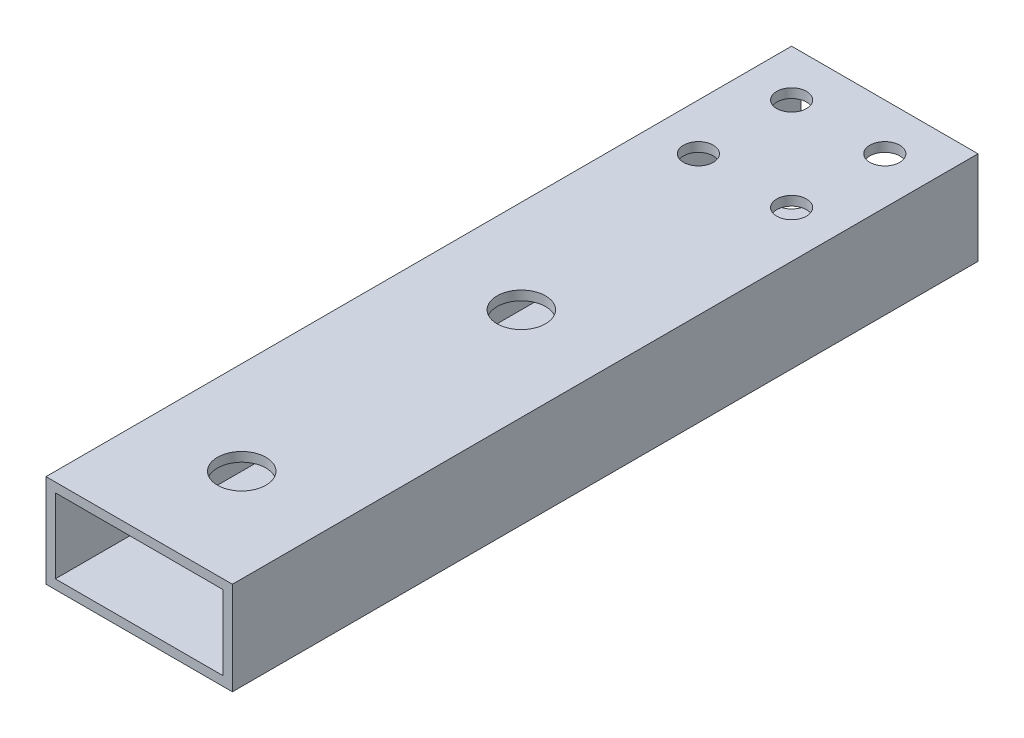
ISO-10303-21;
HEADER;
FILE_DESCRIPTION(('STEP AP214'),'2;1');
FILE_NAME('part.step','',(''),(''),'','','');
FILE_SCHEMA(('AUTOMOTIVE_DESIGN { 1 0 10303 214 1 1 1 1 }'));
ENDSEC;
DATA;
#1=APPLICATION_CONTEXT('core data for automotive mechanical design processes');
#2=APPLICATION_PROTOCOL_DEFINITION('international standard','automotive_design',2000,#1);
#3=PRODUCT_CONTEXT('',#1,'mechanical');
#4=PRODUCT('Part','Part','',(#3));
#5=PRODUCT_RELATED_PRODUCT_CATEGORY('part','',(#4));
#6=PRODUCT_DEFINITION_FORMATION('','',#4);
#7=PRODUCT_DEFINITION_CONTEXT('part definition',#1,'design');
#8=PRODUCT_DEFINITION('design','',#6,#7);
#9=PRODUCT_DEFINITION_SHAPE('','',#8);
#10=(LENGTH_UNIT() NAMED_UNIT(*) SI_UNIT(.MILLI.,.METRE.));
#11=(NAMED_UNIT(*) PLANE_ANGLE_UNIT() SI_UNIT($,.RADIAN.));
#12=(NAMED_UNIT(*) SI_UNIT($,.STERADIAN.) SOLID_ANGLE_UNIT());
#13=UNCERTAINTY_MEASURE_WITH_UNIT(LENGTH_MEASURE(1.E-05),#10,'distance_accuracy_value','');
#14=(GEOMETRIC_REPRESENTATION_CONTEXT(3) GLOBAL_UNCERTAINTY_ASSIGNED_CONTEXT((#13)) GLOBAL_UNIT_ASSIGNED_CONTEXT((#10,
#11,#12)) REPRESENTATION_CONTEXT('',''));
#15=CARTESIAN_POINT('',(0.,0.,0.));
#16=DIRECTION('',(0.,0.,1.));
#17=DIRECTION('',(1.,0.,0.));
#18=AXIS2_PLACEMENT_3D('',#15,#16,#17);
#19=CARTESIAN_POINT('',(0.,0.,80.));
#20=DIRECTION('',(0.,0.,1.));
#21=DIRECTION('',(1.,0.,0.));
#22=AXIS2_PLACEMENT_3D('',#19,#20,#21);
#23=PLANE('',#22);
#24=DIRECTION('',(0.,-1.,0.));
#25=VECTOR('',#24,1.);
#26=CARTESIAN_POINT('',(0.,0.,80.));
#27=LINE('',#26,#25);
#28=CARTESIAN_POINT('',(0.,0.,80.));
#29=VERTEX_POINT('',#28);
#30=CARTESIAN_POINT('',(0.,-10.,80.));
#31=VERTEX_POINT('',#30);
#32=EDGE_CURVE('E185',#29,#31,#27,.T.);
#33=ORIENTED_EDGE('',*,*,#32,.T.);
#34=DIRECTION('',(1.,0.,0.));
#35=VECTOR('',#34,1.);
#36=CARTESIAN_POINT('',(0.,-10.,80.));
#37=LINE('',#36,#35);
#38=CARTESIAN_POINT('',(20.,-10.,80.));
#39=VERTEX_POINT('',#38);
#40=EDGE_CURVE('E189',#31,#39,#37,.T.);
#41=ORIENTED_EDGE('',*,*,#40,.T.);
#42=DIRECTION('',(0.,1.,0.));
#43=VECTOR('',#42,1.);
#44=CARTESIAN_POINT('',(20.,0.,80.));
#45=LINE('',#44,#43);
#46=CARTESIAN_POINT('',(20.,0.,80.));
#47=VERTEX_POINT('',#46);
#48=EDGE_CURVE('E193',#39,#47,#45,.T.);
#49=ORIENTED_EDGE('',*,*,#48,.T.);
#50=DIRECTION('',(-1.,0.,0.));
#51=VECTOR('',#50,1.);
#52=CARTESIAN_POINT('',(0.,0.,80.));
#53=LINE('',#52,#51);
#54=EDGE_CURVE('E196',#47,#29,#53,.T.);
#55=ORIENTED_EDGE('',*,*,#54,.T.);
#56=EDGE_LOOP('',(#33,#41,#49,#55));
#57=FACE_BOUND('',#56,.T.);
#58=DIRECTION('',(1.,0.,0.));
#59=VECTOR('',#58,1.);
#60=CARTESIAN_POINT('',(0.,-9.,80.));
#61=LINE('',#60,#59);
#62=CARTESIAN_POINT('',(1.,-9.,80.));
#63=VERTEX_POINT('',#62);
#64=CARTESIAN_POINT('',(19.,-9.,80.));
#65=VERTEX_POINT('',#64);
#66=EDGE_CURVE('E144',#63,#65,#61,.T.);
#67=ORIENTED_EDGE('',*,*,#66,.F.);
#68=DIRECTION('',(0.,-1.,0.));
#69=VECTOR('',#68,1.);
#70=CARTESIAN_POINT('',(1.,0.,80.));
#71=LINE('',#70,#69);
#72=CARTESIAN_POINT('',(1.,-1.,80.));
#73=VERTEX_POINT('',#72);
#74=EDGE_CURVE('E135',#73,#63,#71,.T.);
#75=ORIENTED_EDGE('',*,*,#74,.F.);
#76=DIRECTION('',(-1.,0.,0.));
#77=VECTOR('',#76,1.);
#78=CARTESIAN_POINT('',(0.,-1.,80.));
#79=LINE('',#78,#77);
#80=CARTESIAN_POINT('',(19.,-1.,80.));
#81=VERTEX_POINT('',#80);
#82=EDGE_CURVE('E161',#81,#73,#79,.T.);
#83=ORIENTED_EDGE('',*,*,#82,.F.);
#84=DIRECTION('',(0.,1.,0.));
#85=VECTOR('',#84,1.);
#86=CARTESIAN_POINT('',(19.,0.,80.));
#87=LINE('',#86,#85);
#88=EDGE_CURVE('E157',#65,#81,#87,.T.);
#89=ORIENTED_EDGE('',*,*,#88,.F.);
#90=EDGE_LOOP('',(#67,#75,#83,#89));
#91=FACE_BOUND('',#90,.T.);
#92=ADVANCED_FACE('F67',(#57,#91),#23,.T.);
#93=CARTESIAN_POINT('',(0.,0.,0.));
#94=DIRECTION('',(0.,0.,1.));
#95=DIRECTION('',(1.,0.,0.));
#96=AXIS2_PLACEMENT_3D('',#93,#94,#95);
#97=PLANE('',#96);
#98=DIRECTION('',(0.,-1.,0.));
#99=VECTOR('',#98,1.);
#100=CARTESIAN_POINT('',(0.,0.,0.));
#101=LINE('',#100,#99);
#102=CARTESIAN_POINT('',(0.,0.,0.));
#103=VERTEX_POINT('',#102);
#104=CARTESIAN_POINT('',(0.,-10.,0.));
#105=VERTEX_POINT('',#104);
#106=EDGE_CURVE('E153',#103,#105,#101,.T.);
#107=ORIENTED_EDGE('',*,*,#106,.F.);
#108=DIRECTION('',(-1.,0.,0.));
#109=VECTOR('',#108,1.);
#110=CARTESIAN_POINT('',(0.,0.,0.));
#111=LINE('',#110,#109);
#112=CARTESIAN_POINT('',(20.,0.,0.));
#113=VERTEX_POINT('',#112);
#114=EDGE_CURVE('E190',#113,#103,#111,.T.);
#115=ORIENTED_EDGE('',*,*,#114,.F.);
#116=DIRECTION('',(0.,1.,0.));
#117=VECTOR('',#116,1.);
#118=CARTESIAN_POINT('',(20.,0.,0.));
#119=LINE('',#118,#117);
#120=CARTESIAN_POINT('',(20.,-10.,0.));
#121=VERTEX_POINT('',#120);
#122=EDGE_CURVE('E206',#121,#113,#119,.T.);
#123=ORIENTED_EDGE('',*,*,#122,.F.);
#124=DIRECTION('',(1.,0.,0.));
#125=VECTOR('',#124,1.);
#126=CARTESIAN_POINT('',(0.,-10.,0.));
#127=LINE('',#126,#125);
#128=EDGE_CURVE('E203',#105,#121,#127,.T.);
#129=ORIENTED_EDGE('',*,*,#128,.F.);
#130=EDGE_LOOP('',(#107,#115,#123,#129));
#131=FACE_BOUND('',#130,.T.);
#132=DIRECTION('',(0.,-1.,0.));
#133=VECTOR('',#132,1.);
#134=CARTESIAN_POINT('',(1.,0.,0.));
#135=LINE('',#134,#133);
#136=CARTESIAN_POINT('',(1.,-1.,0.));
#137=VERTEX_POINT('',#136);
#138=CARTESIAN_POINT('',(1.,-9.,0.));
#139=VERTEX_POINT('',#138);
#140=EDGE_CURVE('E93',#137,#139,#135,.T.);
#141=ORIENTED_EDGE('',*,*,#140,.T.);
#142=DIRECTION('',(1.,0.,0.));
#143=VECTOR('',#142,1.);
#144=CARTESIAN_POINT('',(0.,-9.,0.));
#145=LINE('',#144,#143);
#146=CARTESIAN_POINT('',(19.,-9.,0.));
#147=VERTEX_POINT('',#146);
#148=EDGE_CURVE('E151',#139,#147,#145,.T.);
#149=ORIENTED_EDGE('',*,*,#148,.T.);
#150=DIRECTION('',(0.,1.,0.));
#151=VECTOR('',#150,1.);
#152=CARTESIAN_POINT('',(19.,0.,0.));
#153=LINE('',#152,#151);
#154=CARTESIAN_POINT('',(19.,-1.,0.));
#155=VERTEX_POINT('',#154);
#156=EDGE_CURVE('E172',#147,#155,#153,.T.);
#157=ORIENTED_EDGE('',*,*,#156,.T.);
#158=DIRECTION('',(-1.,0.,0.));
#159=VECTOR('',#158,1.);
#160=CARTESIAN_POINT('',(0.,-1.,0.));
#161=LINE('',#160,#159);
#162=EDGE_CURVE('E145',#155,#137,#161,.T.);
#163=ORIENTED_EDGE('',*,*,#162,.T.);
#164=EDGE_LOOP('',(#141,#149,#157,#163));
#165=FACE_BOUND('',#164,.T.);
#166=ADVANCED_FACE('F284',(#131,#165),#97,.F.);
#167=CARTESIAN_POINT('',(0.,0.,80.));
#168=DIRECTION('',(1.,0.,0.));
#169=DIRECTION('',(0.,0.,-1.));
#170=AXIS2_PLACEMENT_3D('',#167,#168,#169);
#171=PLANE('',#170);
#172=ORIENTED_EDGE('',*,*,#106,.T.);
#173=DIRECTION('',(0.,0.,-1.));
#174=VECTOR('',#173,1.);
#175=CARTESIAN_POINT('',(0.,-10.,80.));
#176=LINE('',#175,#174);
#177=EDGE_CURVE('E12',#31,#105,#176,.T.);
#178=ORIENTED_EDGE('',*,*,#177,.F.);
#179=ORIENTED_EDGE('',*,*,#32,.F.);
#180=DIRECTION('',(0.,0.,-1.));
#181=VECTOR('',#180,1.);
#182=CARTESIAN_POINT('',(0.,0.,80.));
#183=LINE('',#182,#181);
#184=EDGE_CURVE('E199',#29,#103,#183,.T.);
#185=ORIENTED_EDGE('',*,*,#184,.T.);
#186=EDGE_LOOP('',(#172,#178,#179,#185));
#187=FACE_BOUND('',#186,.T.);
#188=ADVANCED_FACE('F69',(#187),#171,.F.);
#189=CARTESIAN_POINT('',(0.,-10.,80.));
#190=DIRECTION('',(0.,1.,0.));
#191=DIRECTION('',(0.,0.,1.));
#192=AXIS2_PLACEMENT_3D('',#189,#190,#191);
#193=PLANE('',#192);
#194=CARTESIAN_POINT('',(15.,-10.,5.));
#195=DIRECTION('',(0.,1.,0.));
#196=DIRECTION('',(0.,0.,-1.));
#197=AXIS2_PLACEMENT_3D('',#194,#195,#196);
#198=CIRCLE('',#197,1.6);
#199=CARTESIAN_POINT('',(15.,-10.,3.4));
#200=VERTEX_POINT('',#199);
#201=EDGE_CURVE('E320',#200,#200,#198,.T.);
#202=ORIENTED_EDGE('',*,*,#201,.T.);
#203=EDGE_LOOP('',(#202));
#204=FACE_BOUND('',#203,.T.);
#205=CARTESIAN_POINT('',(15.,-10.,15.));
#206=DIRECTION('',(0.,1.,0.));
#207=DIRECTION('',(0.,0.,1.));
#208=AXIS2_PLACEMENT_3D('',#205,#206,#207);
#209=CIRCLE('',#208,1.6);
#210=CARTESIAN_POINT('',(15.,-10.,16.6));
#211=VERTEX_POINT('',#210);
#212=EDGE_CURVE('E324',#211,#211,#209,.T.);
#213=ORIENTED_EDGE('',*,*,#212,.T.);
#214=EDGE_LOOP('',(#213));
#215=FACE_BOUND('',#214,.T.);
#216=CARTESIAN_POINT('',(5.,-10.,15.));
#217=DIRECTION('',(0.,1.,0.));
#218=DIRECTION('',(0.,0.,-1.));
#219=AXIS2_PLACEMENT_3D('',#216,#217,#218);
#220=CIRCLE('',#219,1.6);
#221=CARTESIAN_POINT('',(5.,-10.,13.4));
#222=VERTEX_POINT('',#221);
#223=EDGE_CURVE('E328',#222,#222,#220,.T.);
#224=ORIENTED_EDGE('',*,*,#223,.T.);
#225=EDGE_LOOP('',(#224));
#226=FACE_BOUND('',#225,.T.);
#227=CARTESIAN_POINT('',(10.,-10.,69.));
#228=DIRECTION('',(0.,1.,0.));
#229=DIRECTION('',(0.,0.,1.));
#230=AXIS2_PLACEMENT_3D('',#227,#228,#229);
#231=CIRCLE('',#230,2.59999999999999);
#232=CARTESIAN_POINT('',(10.,-10.,71.6));
#233=VERTEX_POINT('',#232);
#234=EDGE_CURVE('E332',#233,#233,#231,.T.);
#235=ORIENTED_EDGE('',*,*,#234,.T.);
#236=EDGE_LOOP('',(#235));
#237=FACE_BOUND('',#236,.T.);
#238=CARTESIAN_POINT('',(10.,-10.,39.));
#239=DIRECTION('',(0.,1.,0.));
#240=DIRECTION('',(0.,0.,1.));
#241=AXIS2_PLACEMENT_3D('',#238,#239,#240);
#242=CIRCLE('',#241,2.60000000000001);
#243=CARTESIAN_POINT('',(10.,-10.,41.6));
#244=VERTEX_POINT('',#243);
#245=EDGE_CURVE('E336',#244,#244,#242,.T.);
#246=ORIENTED_EDGE('',*,*,#245,.T.);
#247=EDGE_LOOP('',(#246));
#248=FACE_BOUND('',#247,.T.);
#249=CARTESIAN_POINT('',(5.,-10.,5.));
#250=DIRECTION('',(0.,1.,0.));
#251=DIRECTION('',(0.,0.,1.));
#252=AXIS2_PLACEMENT_3D('',#249,#250,#251);
#253=CIRCLE('',#252,1.6);
#254=CARTESIAN_POINT('',(5.,-10.,6.6));
#255=VERTEX_POINT('',#254);
#256=EDGE_CURVE('E226',#255,#255,#253,.T.);
#257=ORIENTED_EDGE('',*,*,#256,.T.);
#258=EDGE_LOOP('',(#257));
#259=FACE_BOUND('',#258,.T.);
#260=ORIENTED_EDGE('',*,*,#128,.T.);
#261=DIRECTION('',(0.,0.,-1.));
#262=VECTOR('',#261,1.);
#263=CARTESIAN_POINT('',(20.,-10.,80.));
#264=LINE('',#263,#262);
#265=EDGE_CURVE('E77',#39,#121,#264,.T.);
#266=ORIENTED_EDGE('',*,*,#265,.F.);
#267=ORIENTED_EDGE('',*,*,#40,.F.);
#268=ORIENTED_EDGE('',*,*,#177,.T.);
#269=EDGE_LOOP('',(#260,#266,#267,#268));
#270=FACE_BOUND('',#269,.T.);
#271=ADVANCED_FACE('F309',(#204,#215,#226,#237,#248,#259,#270),#193,.F.);
#272=CARTESIAN_POINT('',(20.,0.,80.));
#273=DIRECTION('',(-1.,0.,0.));
#274=DIRECTION('',(0.,0.,1.));
#275=AXIS2_PLACEMENT_3D('',#272,#273,#274);
#276=PLANE('',#275);
#277=ORIENTED_EDGE('',*,*,#122,.T.);
#278=DIRECTION('',(0.,0.,-1.));
#279=VECTOR('',#278,1.);
#280=CARTESIAN_POINT('',(20.,0.,80.));
#281=LINE('',#280,#279);
#282=EDGE_CURVE('E214',#47,#113,#281,.T.);
#283=ORIENTED_EDGE('',*,*,#282,.F.);
#284=ORIENTED_EDGE('',*,*,#48,.F.);
#285=ORIENTED_EDGE('',*,*,#265,.T.);
#286=EDGE_LOOP('',(#277,#283,#284,#285));
#287=FACE_BOUND('',#286,.T.);
#288=ADVANCED_FACE('F306',(#287),#276,.F.);
#289=CARTESIAN_POINT('',(0.,0.,80.));
#290=DIRECTION('',(0.,-1.,0.));
#291=DIRECTION('',(0.,0.,-1.));
#292=AXIS2_PLACEMENT_3D('',#289,#290,#291);
#293=PLANE('',#292);
#294=CARTESIAN_POINT('',(15.,0.,5.));
#295=DIRECTION('',(0.,1.,0.));
#296=DIRECTION('',(0.,0.,-1.));
#297=AXIS2_PLACEMENT_3D('',#294,#295,#296);
#298=CIRCLE('',#297,1.6);
#299=CARTESIAN_POINT('',(15.,0.,3.4));
#300=VERTEX_POINT('',#299);
#301=EDGE_CURVE('E357',#300,#300,#298,.T.);
#302=ORIENTED_EDGE('',*,*,#301,.F.);
#303=EDGE_LOOP('',(#302));
#304=FACE_BOUND('',#303,.T.);
#305=CARTESIAN_POINT('',(15.,0.,15.));
#306=DIRECTION('',(0.,1.,0.));
#307=DIRECTION('',(0.,0.,1.));
#308=AXIS2_PLACEMENT_3D('',#305,#306,#307);
#309=CIRCLE('',#308,1.6);
#310=CARTESIAN_POINT('',(15.,0.,16.6));
#311=VERTEX_POINT('',#310);
#312=EDGE_CURVE('E434',#311,#311,#309,.T.);
#313=ORIENTED_EDGE('',*,*,#312,.F.);
#314=EDGE_LOOP('',(#313));
#315=FACE_BOUND('',#314,.T.);
#316=CARTESIAN_POINT('',(5.,0.,15.));
#317=DIRECTION('',(0.,1.,0.));
#318=DIRECTION('',(0.,0.,-1.));
#319=AXIS2_PLACEMENT_3D('',#316,#317,#318);
#320=CIRCLE('',#319,1.6);
#321=CARTESIAN_POINT('',(5.,0.,13.4));
#322=VERTEX_POINT('',#321);
#323=EDGE_CURVE('E423',#322,#322,#320,.T.);
#324=ORIENTED_EDGE('',*,*,#323,.F.);
#325=EDGE_LOOP('',(#324));
#326=FACE_BOUND('',#325,.T.);
#327=CARTESIAN_POINT('',(10.,0.,69.));
#328=DIRECTION('',(0.,1.,0.));
#329=DIRECTION('',(0.,0.,1.));
#330=AXIS2_PLACEMENT_3D('',#327,#328,#329);
#331=CIRCLE('',#330,2.59999999999999);
#332=CARTESIAN_POINT('',(10.,0.,71.6));
#333=VERTEX_POINT('',#332);
#334=EDGE_CURVE('E424',#333,#333,#331,.T.);
#335=ORIENTED_EDGE('',*,*,#334,.F.);
#336=EDGE_LOOP('',(#335));
#337=FACE_BOUND('',#336,.T.);
#338=CARTESIAN_POINT('',(10.,0.,39.));
#339=DIRECTION('',(0.,1.,0.));
#340=DIRECTION('',(0.,0.,1.));
#341=AXIS2_PLACEMENT_3D('',#338,#339,#340);
#342=CIRCLE('',#341,2.60000000000001);
#343=CARTESIAN_POINT('',(10.,0.,41.6));
#344=VERTEX_POINT('',#343);
#345=EDGE_CURVE('E445',#344,#344,#342,.T.);
#346=ORIENTED_EDGE('',*,*,#345,.F.);
#347=EDGE_LOOP('',(#346));
#348=FACE_BOUND('',#347,.T.);
#349=CARTESIAN_POINT('',(5.,0.,5.));
#350=DIRECTION('',(0.,1.,0.));
#351=DIRECTION('',(0.,0.,1.));
#352=AXIS2_PLACEMENT_3D('',#349,#350,#351);
#353=CIRCLE('',#352,1.6);
#354=CARTESIAN_POINT('',(5.,0.,6.6));
#355=VERTEX_POINT('',#354);
#356=EDGE_CURVE('E353',#355,#355,#353,.T.);
#357=ORIENTED_EDGE('',*,*,#356,.F.);
#358=EDGE_LOOP('',(#357));
#359=FACE_BOUND('',#358,.T.);
#360=ORIENTED_EDGE('',*,*,#114,.T.);
#361=ORIENTED_EDGE('',*,*,#184,.F.);
#362=ORIENTED_EDGE('',*,*,#54,.F.);
#363=ORIENTED_EDGE('',*,*,#282,.T.);
#364=EDGE_LOOP('',(#360,#361,#362,#363));
#365=FACE_BOUND('',#364,.T.);
#366=ADVANCED_FACE('F303',(#304,#315,#326,#337,#348,#359,#365),#293,.F.);
#367=CARTESIAN_POINT('',(1.,0.,80.));
#368=DIRECTION('',(1.,0.,0.));
#369=DIRECTION('',(0.,0.,-1.));
#370=AXIS2_PLACEMENT_3D('',#367,#368,#369);
#371=PLANE('',#370);
#372=ORIENTED_EDGE('',*,*,#140,.F.);
#373=DIRECTION('',(0.,0.,-1.));
#374=VECTOR('',#373,1.);
#375=CARTESIAN_POINT('',(1.,-1.,80.));
#376=LINE('',#375,#374);
#377=EDGE_CURVE('E139',#73,#137,#376,.T.);
#378=ORIENTED_EDGE('',*,*,#377,.F.);
#379=ORIENTED_EDGE('',*,*,#74,.T.);
#380=DIRECTION('',(0.,0.,-1.));
#381=VECTOR('',#380,1.);
#382=CARTESIAN_POINT('',(1.,-9.,80.));
#383=LINE('',#382,#381);
#384=EDGE_CURVE('E138',#63,#139,#383,.T.);
#385=ORIENTED_EDGE('',*,*,#384,.T.);
#386=EDGE_LOOP('',(#372,#378,#379,#385));
#387=FACE_BOUND('',#386,.T.);
#388=ADVANCED_FACE('F137',(#387),#371,.T.);
#389=CARTESIAN_POINT('',(0.,-9.,80.));
#390=DIRECTION('',(0.,1.,0.));
#391=DIRECTION('',(0.,0.,1.));
#392=AXIS2_PLACEMENT_3D('',#389,#390,#391);
#393=PLANE('',#392);
#394=CARTESIAN_POINT('',(15.,-9.,5.));
#395=DIRECTION('',(0.,1.,0.));
#396=DIRECTION('',(0.,0.,1.));
#397=AXIS2_PLACEMENT_3D('',#394,#395,#396);
#398=CIRCLE('',#397,1.6);
#399=CARTESIAN_POINT('',(15.,-9.,6.6));
#400=VERTEX_POINT('',#399);
#401=EDGE_CURVE('E169',#400,#400,#398,.T.);
#402=ORIENTED_EDGE('',*,*,#401,.F.);
#403=EDGE_LOOP('',(#402));
#404=FACE_BOUND('',#403,.T.);
#405=CARTESIAN_POINT('',(15.,-9.,15.));
#406=DIRECTION('',(0.,1.,0.));
#407=DIRECTION('',(0.,0.,1.));
#408=AXIS2_PLACEMENT_3D('',#405,#406,#407);
#409=CIRCLE('',#408,1.6);
#410=CARTESIAN_POINT('',(15.,-9.,16.6));
#411=VERTEX_POINT('',#410);
#412=EDGE_CURVE('E244',#411,#411,#409,.T.);
#413=ORIENTED_EDGE('',*,*,#412,.F.);
#414=EDGE_LOOP('',(#413));
#415=FACE_BOUND('',#414,.T.);
#416=CARTESIAN_POINT('',(5.,-9.,15.));
#417=DIRECTION('',(0.,1.,0.));
#418=DIRECTION('',(0.,0.,1.));
#419=AXIS2_PLACEMENT_3D('',#416,#417,#418);
#420=CIRCLE('',#419,1.6);
#421=CARTESIAN_POINT('',(5.,-9.,16.6));
#422=VERTEX_POINT('',#421);
#423=EDGE_CURVE('E240',#422,#422,#420,.T.);
#424=ORIENTED_EDGE('',*,*,#423,.F.);
#425=EDGE_LOOP('',(#424));
#426=FACE_BOUND('',#425,.T.);
#427=CARTESIAN_POINT('',(10.,-9.,69.));
#428=DIRECTION('',(0.,1.,0.));
#429=DIRECTION('',(0.,0.,1.));
#430=AXIS2_PLACEMENT_3D('',#427,#428,#429);
#431=CIRCLE('',#430,2.59999999999999);
#432=CARTESIAN_POINT('',(10.,-9.,71.6));
#433=VERTEX_POINT('',#432);
#434=EDGE_CURVE('E236',#433,#433,#431,.T.);
#435=ORIENTED_EDGE('',*,*,#434,.F.);
#436=EDGE_LOOP('',(#435));
#437=FACE_BOUND('',#436,.T.);
#438=CARTESIAN_POINT('',(10.,-9.,39.));
#439=DIRECTION('',(0.,1.,0.));
#440=DIRECTION('',(0.,0.,1.));
#441=AXIS2_PLACEMENT_3D('',#438,#439,#440);
#442=CIRCLE('',#441,2.60000000000001);
#443=CARTESIAN_POINT('',(10.,-9.,41.6));
#444=VERTEX_POINT('',#443);
#445=EDGE_CURVE('E231',#444,#444,#442,.T.);
#446=ORIENTED_EDGE('',*,*,#445,.F.);
#447=EDGE_LOOP('',(#446));
#448=FACE_BOUND('',#447,.T.);
#449=CARTESIAN_POINT('',(5.,-9.,5.));
#450=DIRECTION('',(0.,1.,0.));
#451=DIRECTION('',(0.,0.,1.));
#452=AXIS2_PLACEMENT_3D('',#449,#450,#451);
#453=CIRCLE('',#452,1.6);
#454=CARTESIAN_POINT('',(5.,-9.,6.6));
#455=VERTEX_POINT('',#454);
#456=EDGE_CURVE('E225',#455,#455,#453,.T.);
#457=ORIENTED_EDGE('',*,*,#456,.F.);
#458=EDGE_LOOP('',(#457));
#459=FACE_BOUND('',#458,.T.);
#460=ORIENTED_EDGE('',*,*,#148,.F.);
#461=ORIENTED_EDGE('',*,*,#384,.F.);
#462=ORIENTED_EDGE('',*,*,#66,.T.);
#463=DIRECTION('',(0.,0.,-1.));
#464=VECTOR('',#463,1.);
#465=CARTESIAN_POINT('',(19.,-9.,80.));
#466=LINE('',#465,#464);
#467=EDGE_CURVE('E154',#65,#147,#466,.T.);
#468=ORIENTED_EDGE('',*,*,#467,.T.);
#469=EDGE_LOOP('',(#460,#461,#462,#468));
#470=FACE_BOUND('',#469,.T.);
#471=ADVANCED_FACE('F148',(#404,#415,#426,#437,#448,#459,#470),#393,.T.);
#472=CARTESIAN_POINT('',(19.,0.,80.));
#473=DIRECTION('',(-1.,0.,0.));
#474=DIRECTION('',(0.,0.,1.));
#475=AXIS2_PLACEMENT_3D('',#472,#473,#474);
#476=PLANE('',#475);
#477=ORIENTED_EDGE('',*,*,#156,.F.);
#478=ORIENTED_EDGE('',*,*,#467,.F.);
#479=ORIENTED_EDGE('',*,*,#88,.T.);
#480=DIRECTION('',(0.,0.,-1.));
#481=VECTOR('',#480,1.);
#482=CARTESIAN_POINT('',(19.,-1.,80.));
#483=LINE('',#482,#481);
#484=EDGE_CURVE('E85',#81,#155,#483,.T.);
#485=ORIENTED_EDGE('',*,*,#484,.T.);
#486=EDGE_LOOP('',(#477,#478,#479,#485));
#487=FACE_BOUND('',#486,.T.);
#488=ADVANCED_FACE('F272',(#487),#476,.T.);
#489=CARTESIAN_POINT('',(0.,-1.,80.));
#490=DIRECTION('',(0.,-1.,0.));
#491=DIRECTION('',(0.,0.,-1.));
#492=AXIS2_PLACEMENT_3D('',#489,#490,#491);
#493=PLANE('',#492);
#494=CARTESIAN_POINT('',(15.,-0.999999999999999,5.));
#495=DIRECTION('',(0.,-1.,0.));
#496=DIRECTION('',(0.,0.,-1.));
#497=AXIS2_PLACEMENT_3D('',#494,#495,#496);
#498=CIRCLE('',#497,1.6);
#499=CARTESIAN_POINT('',(15.,-0.999999999999999,3.4));
#500=VERTEX_POINT('',#499);
#501=EDGE_CURVE('E71',#500,#500,#498,.T.);
#502=ORIENTED_EDGE('',*,*,#501,.F.);
#503=EDGE_LOOP('',(#502));
#504=FACE_BOUND('',#503,.T.);
#505=CARTESIAN_POINT('',(15.,-0.999999999999999,15.));
#506=DIRECTION('',(0.,-1.,0.));
#507=DIRECTION('',(0.,0.,-1.));
#508=AXIS2_PLACEMENT_3D('',#505,#506,#507);
#509=CIRCLE('',#508,1.6);
#510=CARTESIAN_POINT('',(15.,-0.999999999999999,13.4));
#511=VERTEX_POINT('',#510);
#512=EDGE_CURVE('E241',#511,#511,#509,.T.);
#513=ORIENTED_EDGE('',*,*,#512,.F.);
#514=EDGE_LOOP('',(#513));
#515=FACE_BOUND('',#514,.T.);
#516=CARTESIAN_POINT('',(5.,-0.999999999999999,15.));
#517=DIRECTION('',(0.,-1.,0.));
#518=DIRECTION('',(0.,0.,-1.));
#519=AXIS2_PLACEMENT_3D('',#516,#517,#518);
#520=CIRCLE('',#519,1.6);
#521=CARTESIAN_POINT('',(5.,-0.999999999999999,13.4));
#522=VERTEX_POINT('',#521);
#523=EDGE_CURVE('E237',#522,#522,#520,.T.);
#524=ORIENTED_EDGE('',*,*,#523,.F.);
#525=EDGE_LOOP('',(#524));
#526=FACE_BOUND('',#525,.T.);
#527=CARTESIAN_POINT('',(10.,-0.999999999999999,69.));
#528=DIRECTION('',(0.,-1.,0.));
#529=DIRECTION('',(0.,0.,-1.));
#530=AXIS2_PLACEMENT_3D('',#527,#528,#529);
#531=CIRCLE('',#530,2.59999999999999);
#532=CARTESIAN_POINT('',(10.,-0.999999999999999,66.4));
#533=VERTEX_POINT('',#532);
#534=EDGE_CURVE('E232',#533,#533,#531,.T.);
#535=ORIENTED_EDGE('',*,*,#534,.F.);
#536=EDGE_LOOP('',(#535));
#537=FACE_BOUND('',#536,.T.);
#538=CARTESIAN_POINT('',(10.,-0.999999999999999,39.));
#539=DIRECTION('',(0.,-1.,0.));
#540=DIRECTION('',(0.,0.,-1.));
#541=AXIS2_PLACEMENT_3D('',#538,#539,#540);
#542=CIRCLE('',#541,2.60000000000001);
#543=CARTESIAN_POINT('',(10.,-0.999999999999999,36.4));
#544=VERTEX_POINT('',#543);
#545=EDGE_CURVE('E227',#544,#544,#542,.T.);
#546=ORIENTED_EDGE('',*,*,#545,.F.);
#547=EDGE_LOOP('',(#546));
#548=FACE_BOUND('',#547,.T.);
#549=CARTESIAN_POINT('',(5.,-0.999999999999999,5.));
#550=DIRECTION('',(0.,-1.,0.));
#551=DIRECTION('',(0.,0.,-1.));
#552=AXIS2_PLACEMENT_3D('',#549,#550,#551);
#553=CIRCLE('',#552,1.6);
#554=CARTESIAN_POINT('',(5.,-0.999999999999999,3.4));
#555=VERTEX_POINT('',#554);
#556=EDGE_CURVE('E221',#555,#555,#553,.T.);
#557=ORIENTED_EDGE('',*,*,#556,.F.);
#558=EDGE_LOOP('',(#557));
#559=FACE_BOUND('',#558,.T.);
#560=ORIENTED_EDGE('',*,*,#162,.F.);
#561=ORIENTED_EDGE('',*,*,#484,.F.);
#562=ORIENTED_EDGE('',*,*,#82,.T.);
#563=ORIENTED_EDGE('',*,*,#377,.T.);
#564=EDGE_LOOP('',(#560,#561,#562,#563));
#565=FACE_BOUND('',#564,.T.);
#566=ADVANCED_FACE('F268',(#504,#515,#526,#537,#548,#559,#565),#493,.T.);
#567=CARTESIAN_POINT('',(5.,-10.,5.));
#568=DIRECTION('',(0.,1.,0.));
#569=DIRECTION('',(0.,0.,1.));
#570=AXIS2_PLACEMENT_3D('',#567,#568,#569);
#571=CYLINDRICAL_SURFACE('',#570,1.6);
#572=ORIENTED_EDGE('',*,*,#556,.T.);
#573=EDGE_LOOP('',(#572));
#574=FACE_BOUND('',#573,.T.);
#575=ORIENTED_EDGE('',*,*,#356,.T.);
#576=EDGE_LOOP('',(#575));
#577=FACE_BOUND('',#576,.T.);
#578=ADVANCED_FACE('F271',(#574,#577),#571,.F.);
#579=CARTESIAN_POINT('',(10.,-10.,39.));
#580=DIRECTION('',(0.,1.,0.));
#581=DIRECTION('',(0.,0.,1.));
#582=AXIS2_PLACEMENT_3D('',#579,#580,#581);
#583=CYLINDRICAL_SURFACE('',#582,2.60000000000001);
#584=ORIENTED_EDGE('',*,*,#545,.T.);
#585=EDGE_LOOP('',(#584));
#586=FACE_BOUND('',#585,.T.);
#587=ORIENTED_EDGE('',*,*,#345,.T.);
#588=EDGE_LOOP('',(#587));
#589=FACE_BOUND('',#588,.T.);
#590=ADVANCED_FACE('F383',(#586,#589),#583,.F.);
#591=CARTESIAN_POINT('',(10.,-10.,69.));
#592=DIRECTION('',(0.,1.,0.));
#593=DIRECTION('',(0.,0.,1.));
#594=AXIS2_PLACEMENT_3D('',#591,#592,#593);
#595=CYLINDRICAL_SURFACE('',#594,2.59999999999999);
#596=ORIENTED_EDGE('',*,*,#534,.T.);
#597=EDGE_LOOP('',(#596));
#598=FACE_BOUND('',#597,.T.);
#599=ORIENTED_EDGE('',*,*,#334,.T.);
#600=EDGE_LOOP('',(#599));
#601=FACE_BOUND('',#600,.T.);
#602=ADVANCED_FACE('F393',(#598,#601),#595,.F.);
#603=CARTESIAN_POINT('',(5.,-10.,15.));
#604=DIRECTION('',(0.,1.,0.));
#605=DIRECTION('',(0.,0.,1.));
#606=AXIS2_PLACEMENT_3D('',#603,#604,#605);
#607=CYLINDRICAL_SURFACE('',#606,1.6);
#608=ORIENTED_EDGE('',*,*,#523,.T.);
#609=EDGE_LOOP('',(#608));
#610=FACE_BOUND('',#609,.T.);
#611=ORIENTED_EDGE('',*,*,#323,.T.);
#612=EDGE_LOOP('',(#611));
#613=FACE_BOUND('',#612,.T.);
#614=ADVANCED_FACE('F401',(#610,#613),#607,.F.);
#615=CARTESIAN_POINT('',(15.,-10.,15.));
#616=DIRECTION('',(0.,1.,0.));
#617=DIRECTION('',(0.,0.,1.));
#618=AXIS2_PLACEMENT_3D('',#615,#616,#617);
#619=CYLINDRICAL_SURFACE('',#618,1.6);
#620=ORIENTED_EDGE('',*,*,#512,.T.);
#621=EDGE_LOOP('',(#620));
#622=FACE_BOUND('',#621,.T.);
#623=ORIENTED_EDGE('',*,*,#312,.T.);
#624=EDGE_LOOP('',(#623));
#625=FACE_BOUND('',#624,.T.);
#626=ADVANCED_FACE('F384',(#622,#625),#619,.F.);
#627=CARTESIAN_POINT('',(15.,-10.,5.));
#628=DIRECTION('',(0.,1.,0.));
#629=DIRECTION('',(0.,0.,1.));
#630=AXIS2_PLACEMENT_3D('',#627,#628,#629);
#631=CYLINDRICAL_SURFACE('',#630,1.6);
#632=ORIENTED_EDGE('',*,*,#501,.T.);
#633=EDGE_LOOP('',(#632));
#634=FACE_BOUND('',#633,.T.);
#635=ORIENTED_EDGE('',*,*,#301,.T.);
#636=EDGE_LOOP('',(#635));
#637=FACE_BOUND('',#636,.T.);
#638=ADVANCED_FACE('F265',(#634,#637),#631,.F.);
#639=ORIENTED_EDGE('',*,*,#456,.T.);
#640=EDGE_LOOP('',(#639));
#641=FACE_BOUND('',#640,.T.);
#642=ORIENTED_EDGE('',*,*,#256,.F.);
#643=EDGE_LOOP('',(#642));
#644=FACE_BOUND('',#643,.T.);
#645=ADVANCED_FACE('F374',(#641,#644),#571,.F.);
#646=ORIENTED_EDGE('',*,*,#445,.T.);
#647=EDGE_LOOP('',(#646));
#648=FACE_BOUND('',#647,.T.);
#649=ORIENTED_EDGE('',*,*,#245,.F.);
#650=EDGE_LOOP('',(#649));
#651=FACE_BOUND('',#650,.T.);
#652=ADVANCED_FACE('F368',(#648,#651),#583,.F.);
#653=ORIENTED_EDGE('',*,*,#434,.T.);
#654=EDGE_LOOP('',(#653));
#655=FACE_BOUND('',#654,.T.);
#656=ORIENTED_EDGE('',*,*,#234,.F.);
#657=EDGE_LOOP('',(#656));
#658=FACE_BOUND('',#657,.T.);
#659=ADVANCED_FACE('F381',(#655,#658),#595,.F.);
#660=ORIENTED_EDGE('',*,*,#423,.T.);
#661=EDGE_LOOP('',(#660));
#662=FACE_BOUND('',#661,.T.);
#663=ORIENTED_EDGE('',*,*,#223,.F.);
#664=EDGE_LOOP('',(#663));
#665=FACE_BOUND('',#664,.T.);
#666=ADVANCED_FACE('F410',(#662,#665),#607,.F.);
#667=ORIENTED_EDGE('',*,*,#412,.T.);
#668=EDGE_LOOP('',(#667));
#669=FACE_BOUND('',#668,.T.);
#670=ORIENTED_EDGE('',*,*,#212,.F.);
#671=EDGE_LOOP('',(#670));
#672=FACE_BOUND('',#671,.T.);
#673=ADVANCED_FACE('F407',(#669,#672),#619,.F.);
#674=ORIENTED_EDGE('',*,*,#401,.T.);
#675=EDGE_LOOP('',(#674));
#676=FACE_BOUND('',#675,.T.);
#677=ORIENTED_EDGE('',*,*,#201,.F.);
#678=EDGE_LOOP('',(#677));
#679=FACE_BOUND('',#678,.T.);
#680=ADVANCED_FACE('F386',(#676,#679),#631,.F.);
#681=CLOSED_SHELL('',(#92,#166,#188,#271,#288,#366,#388,#471,#488,#566,#578,#590,#602,#614,#626,
#638,#645,#652,#659,#666,#673,#680));
#682=MANIFOLD_SOLID_BREP('B2',#681);
#683=ADVANCED_BREP_SHAPE_REPRESENTATION('',(#18,#682),#14);
#684=SHAPE_DEFINITION_REPRESENTATION(#9,#683);
ENDSEC;
END-ISO-10303-21;
